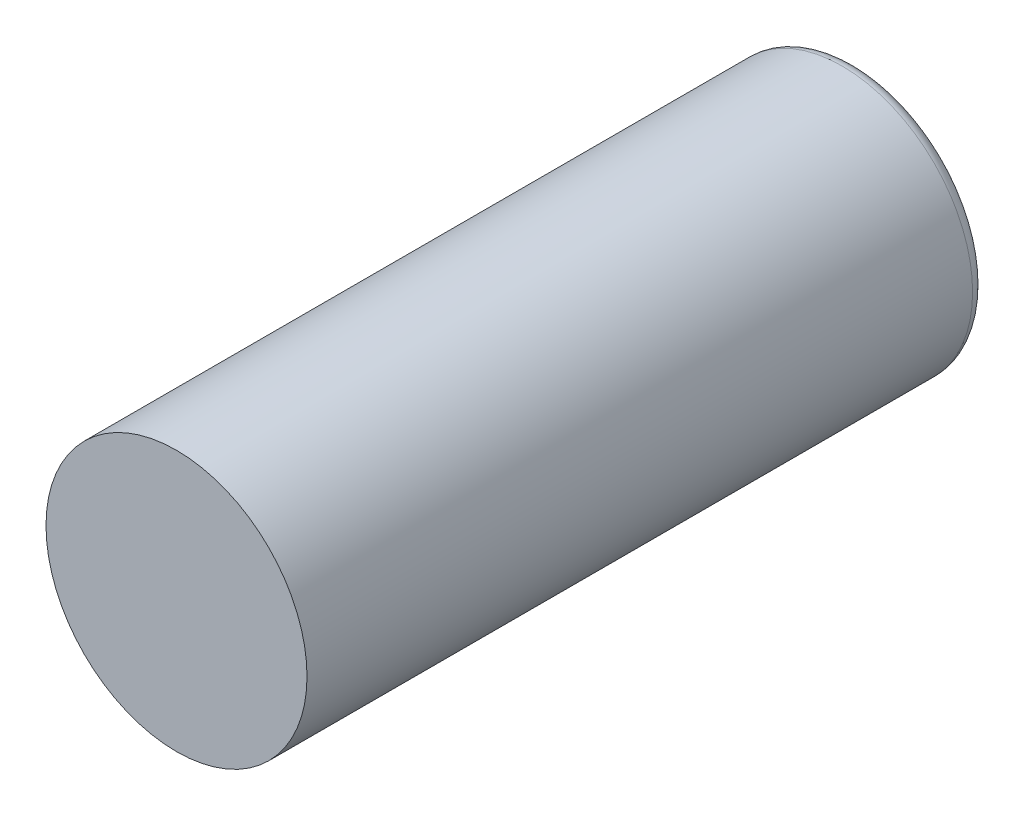
ISO-10303-21;
HEADER;
FILE_DESCRIPTION(('STEP AP214'),'2;1');
FILE_NAME('part.step','',(''),(''),'','','');
FILE_SCHEMA(('AUTOMOTIVE_DESIGN { 1 0 10303 214 1 1 1 1 }'));
ENDSEC;
DATA;
#1=APPLICATION_CONTEXT('core data for automotive mechanical design processes');
#2=APPLICATION_PROTOCOL_DEFINITION('international standard','automotive_design',2000,#1);
#3=PRODUCT_CONTEXT('',#1,'mechanical');
#4=PRODUCT('Part','Part','',(#3));
#5=PRODUCT_RELATED_PRODUCT_CATEGORY('part','',(#4));
#6=PRODUCT_DEFINITION_FORMATION('','',#4);
#7=PRODUCT_DEFINITION_CONTEXT('part definition',#1,'design');
#8=PRODUCT_DEFINITION('design','',#6,#7);
#9=PRODUCT_DEFINITION_SHAPE('','',#8);
#10=(LENGTH_UNIT() NAMED_UNIT(*) SI_UNIT(.MILLI.,.METRE.));
#11=(NAMED_UNIT(*) PLANE_ANGLE_UNIT() SI_UNIT($,.RADIAN.));
#12=(NAMED_UNIT(*) SI_UNIT($,.STERADIAN.) SOLID_ANGLE_UNIT());
#13=UNCERTAINTY_MEASURE_WITH_UNIT(LENGTH_MEASURE(1.E-05),#10,'distance_accuracy_value','');
#14=(GEOMETRIC_REPRESENTATION_CONTEXT(3) GLOBAL_UNCERTAINTY_ASSIGNED_CONTEXT((#13)) GLOBAL_UNIT_ASSIGNED_CONTEXT((#10,
#11,#12)) REPRESENTATION_CONTEXT('',''));
#15=CARTESIAN_POINT('',(0.,0.,0.));
#16=DIRECTION('',(0.,0.,1.));
#17=DIRECTION('',(1.,0.,0.));
#18=AXIS2_PLACEMENT_3D('',#15,#16,#17);
#19=CARTESIAN_POINT('',(0.,0.,13.));
#20=DIRECTION('',(0.,0.,-1.));
#21=DIRECTION('',(-1.,0.,0.));
#22=AXIS2_PLACEMENT_3D('',#19,#20,#21);
#23=CYLINDRICAL_SURFACE('',#22,2.5);
#24=CARTESIAN_POINT('',(0.,0.,0.25));
#25=DIRECTION('',(0.,0.,1.));
#26=DIRECTION('',(1.,0.,0.));
#27=AXIS2_PLACEMENT_3D('',#24,#25,#26);
#28=CIRCLE('',#27,2.5);
#29=CARTESIAN_POINT('',(-2.5,0.,0.25));
#30=VERTEX_POINT('',#29);
#31=EDGE_CURVE('E41',#30,#30,#28,.T.);
#32=CARTESIAN_POINT('',(0.,0.,13.));
#33=DIRECTION('',(0.,0.,1.));
#34=DIRECTION('',(1.,0.,0.));
#35=AXIS2_PLACEMENT_3D('',#32,#33,#34);
#36=CIRCLE('',#35,2.5);
#37=CARTESIAN_POINT('',(-2.5,0.,13.));
#38=VERTEX_POINT('',#37);
#39=EDGE_CURVE('E45',#38,#38,#36,.T.);
#40=CARTESIAN_POINT('',(-2.5,0.,0.25));
#41=CARTESIAN_POINT('',(-2.5,0.,0.3828125));
#42=CARTESIAN_POINT('',(-2.5,0.,0.515625));
#43=CARTESIAN_POINT('',(-2.5,0.,0.78125));
#44=CARTESIAN_POINT('',(-2.5,0.,0.9140625));
#45=CARTESIAN_POINT('',(-2.5,0.,1.1796875));
#46=CARTESIAN_POINT('',(-2.5,0.,1.3125));
#47=CARTESIAN_POINT('',(-2.5,0.,1.578125));
#48=CARTESIAN_POINT('',(-2.5,0.,1.7109375));
#49=CARTESIAN_POINT('',(-2.5,0.,1.9765625));
#50=CARTESIAN_POINT('',(-2.5,0.,2.109375));
#51=CARTESIAN_POINT('',(-2.5,0.,2.375));
#52=CARTESIAN_POINT('',(-2.5,0.,2.5078125));
#53=CARTESIAN_POINT('',(-2.5,0.,2.7734375));
#54=CARTESIAN_POINT('',(-2.5,0.,2.90625));
#55=CARTESIAN_POINT('',(-2.5,0.,3.171875));
#56=CARTESIAN_POINT('',(-2.5,0.,3.3046875));
#57=CARTESIAN_POINT('',(-2.5,0.,3.5703125));
#58=CARTESIAN_POINT('',(-2.5,0.,3.703125));
#59=CARTESIAN_POINT('',(-2.5,0.,3.96875));
#60=CARTESIAN_POINT('',(-2.5,0.,4.1015625));
#61=CARTESIAN_POINT('',(-2.5,0.,4.3671875));
#62=CARTESIAN_POINT('',(-2.5,0.,4.5));
#63=CARTESIAN_POINT('',(-2.5,0.,4.765625));
#64=CARTESIAN_POINT('',(-2.5,0.,4.8984375));
#65=CARTESIAN_POINT('',(-2.5,0.,5.1640625));
#66=CARTESIAN_POINT('',(-2.5,0.,5.296875));
#67=CARTESIAN_POINT('',(-2.5,0.,5.5625));
#68=CARTESIAN_POINT('',(-2.5,0.,5.6953125));
#69=CARTESIAN_POINT('',(-2.5,0.,5.9609375));
#70=CARTESIAN_POINT('',(-2.5,0.,6.09375));
#71=CARTESIAN_POINT('',(-2.5,0.,6.359375));
#72=CARTESIAN_POINT('',(-2.5,0.,6.4921875));
#73=CARTESIAN_POINT('',(-2.5,0.,6.7578125));
#74=CARTESIAN_POINT('',(-2.5,0.,6.890625));
#75=CARTESIAN_POINT('',(-2.5,0.,7.15625));
#76=CARTESIAN_POINT('',(-2.5,0.,7.2890625));
#77=CARTESIAN_POINT('',(-2.5,0.,7.5546875));
#78=CARTESIAN_POINT('',(-2.5,0.,7.6875));
#79=CARTESIAN_POINT('',(-2.5,0.,7.953125));
#80=CARTESIAN_POINT('',(-2.5,0.,8.0859375));
#81=CARTESIAN_POINT('',(-2.5,0.,8.3515625));
#82=CARTESIAN_POINT('',(-2.5,0.,8.484375));
#83=CARTESIAN_POINT('',(-2.5,0.,8.75));
#84=CARTESIAN_POINT('',(-2.5,0.,8.8828125));
#85=CARTESIAN_POINT('',(-2.5,0.,9.1484375));
#86=CARTESIAN_POINT('',(-2.5,0.,9.28125));
#87=CARTESIAN_POINT('',(-2.5,0.,9.546875));
#88=CARTESIAN_POINT('',(-2.5,0.,9.6796875));
#89=CARTESIAN_POINT('',(-2.5,0.,9.9453125));
#90=CARTESIAN_POINT('',(-2.5,0.,10.078125));
#91=CARTESIAN_POINT('',(-2.5,0.,10.34375));
#92=CARTESIAN_POINT('',(-2.5,0.,10.4765625));
#93=CARTESIAN_POINT('',(-2.5,0.,10.7421875));
#94=CARTESIAN_POINT('',(-2.5,0.,10.875));
#95=CARTESIAN_POINT('',(-2.5,0.,11.140625));
#96=CARTESIAN_POINT('',(-2.5,0.,11.2734375));
#97=CARTESIAN_POINT('',(-2.5,0.,11.5390625));
#98=CARTESIAN_POINT('',(-2.5,0.,11.671875));
#99=CARTESIAN_POINT('',(-2.5,0.,11.9375));
#100=CARTESIAN_POINT('',(-2.5,0.,12.0703125));
#101=CARTESIAN_POINT('',(-2.5,0.,12.3359375));
#102=CARTESIAN_POINT('',(-2.5,0.,12.46875));
#103=CARTESIAN_POINT('',(-2.5,0.,12.734375));
#104=CARTESIAN_POINT('',(-2.5,0.,12.8671875));
#105=CARTESIAN_POINT('',(-2.5,0.,13.));
#106=B_SPLINE_CURVE_WITH_KNOTS('',3,(#40,#41,#42,#43,#44,#45,#46,#47,#48,#49,#50,#51,#52,#53,
#54,#55,#56,#57,#58,#59,#60,#61,#62,#63,#64,#65,#66,#67,#68,#69,#70,#71,#72,#73,#74,#75,#76,#77,
#78,#79,#80,#81,#82,#83,#84,#85,#86,#87,#88,#89,#90,#91,#92,#93,#94,#95,#96,#97,#98,#99,#100,
#101,#102,#103,#104,#105),.UNSPECIFIED.,.F.,.F.,(4,2,2,2,2,2,2,2,2,2,2,2,2,2,2,2,2,2,2,2,2,2,2,
2,2,2,2,2,2,2,2,2,4),(0.,0.3984375,0.796875000000001,1.1953125,1.59375,1.9921875,2.390625,
2.7890625,3.1875,3.5859375,3.984375,4.3828125,4.78125,5.1796875,5.578125,5.9765625,6.375,
6.7734375,7.171875,7.5703125,7.96875,8.3671875,8.765625,9.1640625,9.5625,9.9609375,10.359375,
10.7578125,11.15625,11.5546875,11.953125,12.3515625,12.75),.UNSPECIFIED.);
#107=EDGE_CURVE('BSEAM34',#30,#38,#106,.T.);
#108=ORIENTED_EDGE('',*,*,#31,.T.);
#109=ORIENTED_EDGE('',*,*,#39,.F.);
#110=ORIENTED_EDGE('',*,*,#107,.T.);
#111=ORIENTED_EDGE('',*,*,#107,.F.);
#112=EDGE_LOOP('',(#108,#110,#109,#111));
#113=FACE_BOUND('',#112,.T.);
#114=ADVANCED_FACE('F34',(#113),#23,.T.);
#115=CARTESIAN_POINT('',(0.,0.,13.));
#116=DIRECTION('',(0.,0.,1.));
#117=DIRECTION('',(1.,0.,0.));
#118=AXIS2_PLACEMENT_3D('',#115,#116,#117);
#119=PLANE('',#118);
#120=ORIENTED_EDGE('',*,*,#39,.T.);
#121=EDGE_LOOP('',(#120));
#122=FACE_BOUND('',#121,.T.);
#123=ADVANCED_FACE('F52',(#122),#119,.T.);
#124=CARTESIAN_POINT('',(0.,0.,0.));
#125=DIRECTION('',(0.,0.,1.));
#126=DIRECTION('',(1.,0.,0.));
#127=AXIS2_PLACEMENT_3D('',#124,#125,#126);
#128=PLANE('',#127);
#129=CARTESIAN_POINT('',(0.,0.,0.));
#130=DIRECTION('',(0.,0.,1.));
#131=DIRECTION('',(1.,0.,0.));
#132=AXIS2_PLACEMENT_3D('',#129,#130,#131);
#133=CIRCLE('',#132,2.25);
#134=CARTESIAN_POINT('',(2.25,0.,0.));
#135=VERTEX_POINT('',#134);
#136=EDGE_CURVE('E10',#135,#135,#133,.F.);
#137=ORIENTED_EDGE('',*,*,#136,.T.);
#138=EDGE_LOOP('',(#137));
#139=FACE_BOUND('',#138,.T.);
#140=ADVANCED_FACE('F58',(#139),#128,.F.);
#141=CARTESIAN_POINT('',(0.,0.,0.25));
#142=DIRECTION('',(0.,0.,1.));
#143=DIRECTION('',(1.,0.,0.));
#144=AXIS2_PLACEMENT_3D('',#141,#142,#143);
#145=TOROIDAL_SURFACE('',#144,2.25,0.25);
#146=ORIENTED_EDGE('',*,*,#136,.F.);
#147=EDGE_LOOP('',(#146));
#148=FACE_BOUND('',#147,.T.);
#149=ORIENTED_EDGE('',*,*,#31,.F.);
#150=EDGE_LOOP('',(#149));
#151=FACE_BOUND('',#150,.T.);
#152=ADVANCED_FACE('F36',(#148,#151),#145,.T.);
#153=CLOSED_SHELL('',(#114,#123,#140,#152));
#154=MANIFOLD_SOLID_BREP('B2',#153);
#155=ADVANCED_BREP_SHAPE_REPRESENTATION('',(#18,#154),#14);
#156=SHAPE_DEFINITION_REPRESENTATION(#9,#155);
ENDSEC;
END-ISO-10303-21;
